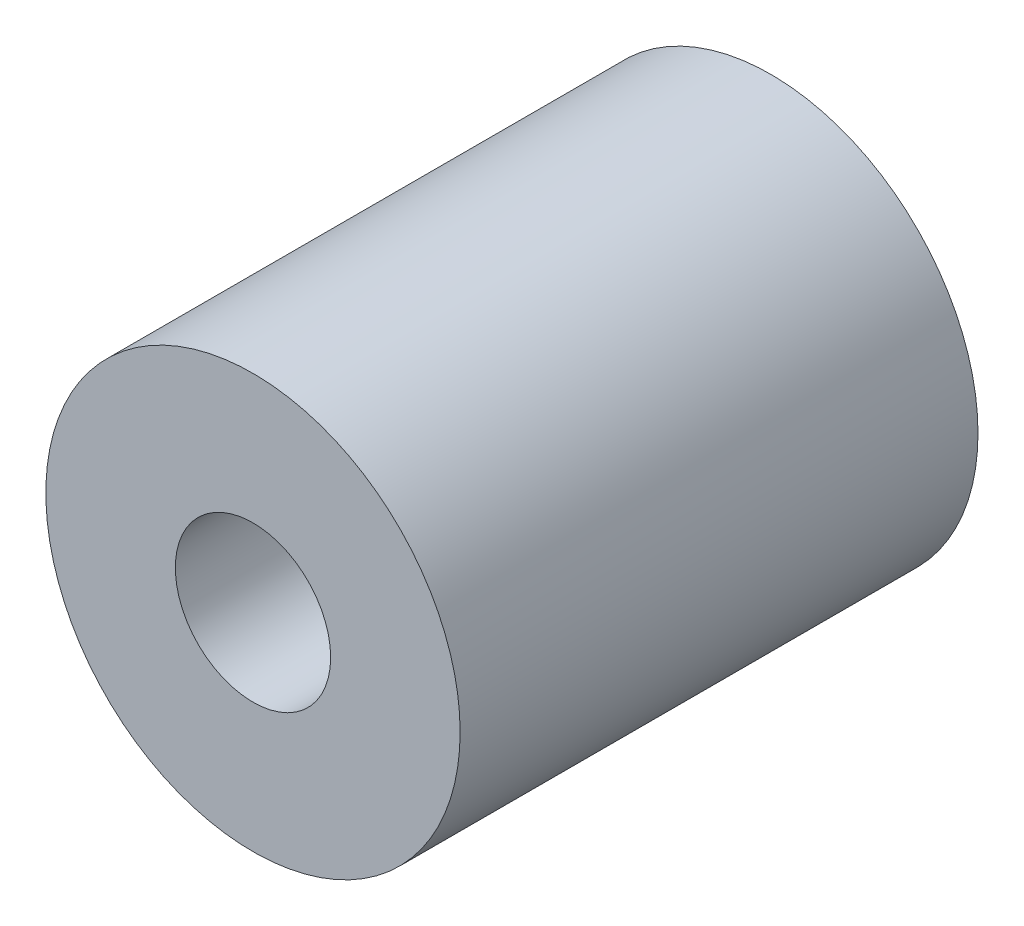
ISO-10303-21;
HEADER;
FILE_DESCRIPTION(('STEP AP214'),'2;1');
FILE_NAME('part.step','',(''),(''),'','','');
FILE_SCHEMA(('AUTOMOTIVE_DESIGN { 1 0 10303 214 1 1 1 1 }'));
ENDSEC;
DATA;
#1=APPLICATION_CONTEXT('core data for automotive mechanical design processes');
#2=APPLICATION_PROTOCOL_DEFINITION('international standard','automotive_design',2000,#1);
#3=PRODUCT_CONTEXT('',#1,'mechanical');
#4=PRODUCT('Part','Part','',(#3));
#5=PRODUCT_RELATED_PRODUCT_CATEGORY('part','',(#4));
#6=PRODUCT_DEFINITION_FORMATION('','',#4);
#7=PRODUCT_DEFINITION_CONTEXT('part definition',#1,'design');
#8=PRODUCT_DEFINITION('design','',#6,#7);
#9=PRODUCT_DEFINITION_SHAPE('','',#8);
#10=(LENGTH_UNIT() NAMED_UNIT(*) SI_UNIT(.MILLI.,.METRE.));
#11=(NAMED_UNIT(*) PLANE_ANGLE_UNIT() SI_UNIT($,.RADIAN.));
#12=(NAMED_UNIT(*) SI_UNIT($,.STERADIAN.) SOLID_ANGLE_UNIT());
#13=UNCERTAINTY_MEASURE_WITH_UNIT(LENGTH_MEASURE(1.E-05),#10,'distance_accuracy_value','');
#14=(GEOMETRIC_REPRESENTATION_CONTEXT(3) GLOBAL_UNCERTAINTY_ASSIGNED_CONTEXT((#13)) GLOBAL_UNIT_ASSIGNED_CONTEXT((#10,
#11,#12)) REPRESENTATION_CONTEXT('',''));
#15=CARTESIAN_POINT('',(0.,0.,0.));
#16=DIRECTION('',(0.,0.,1.));
#17=DIRECTION('',(1.,0.,0.));
#18=AXIS2_PLACEMENT_3D('',#15,#16,#17);
#19=CARTESIAN_POINT('',(0.,0.,10.));
#20=DIRECTION('',(0.,0.,1.));
#21=DIRECTION('',(1.,0.,0.));
#22=AXIS2_PLACEMENT_3D('',#19,#20,#21);
#23=PLANE('',#22);
#24=CARTESIAN_POINT('',(0.,0.,10.));
#25=DIRECTION('',(0.,0.,1.));
#26=DIRECTION('',(1.,0.,0.));
#27=AXIS2_PLACEMENT_3D('',#24,#25,#26);
#28=CIRCLE('',#27,4.);
#29=CARTESIAN_POINT('',(4.,0.,10.));
#30=VERTEX_POINT('',#29);
#31=EDGE_CURVE('E10',#30,#30,#28,.T.);
#32=ORIENTED_EDGE('',*,*,#31,.T.);
#33=EDGE_LOOP('',(#32));
#34=FACE_BOUND('',#33,.T.);
#35=CARTESIAN_POINT('',(0.,0.,10.));
#36=DIRECTION('',(0.,0.,1.));
#37=DIRECTION('',(1.,0.,0.));
#38=AXIS2_PLACEMENT_3D('',#35,#36,#37);
#39=CIRCLE('',#38,1.5);
#40=CARTESIAN_POINT('',(1.5,0.,10.));
#41=VERTEX_POINT('',#40);
#42=EDGE_CURVE('E42',#41,#41,#39,.T.);
#43=ORIENTED_EDGE('',*,*,#42,.F.);
#44=EDGE_LOOP('',(#43));
#45=FACE_BOUND('',#44,.T.);
#46=ADVANCED_FACE('F31',(#34,#45),#23,.T.);
#47=CARTESIAN_POINT('',(0.,0.,0.));
#48=DIRECTION('',(0.,0.,1.));
#49=DIRECTION('',(1.,0.,0.));
#50=AXIS2_PLACEMENT_3D('',#47,#48,#49);
#51=PLANE('',#50);
#52=CARTESIAN_POINT('',(0.,0.,0.));
#53=DIRECTION('',(0.,0.,1.));
#54=DIRECTION('',(1.,0.,0.));
#55=AXIS2_PLACEMENT_3D('',#52,#53,#54);
#56=CIRCLE('',#55,4.);
#57=CARTESIAN_POINT('',(4.,0.,0.));
#58=VERTEX_POINT('',#57);
#59=EDGE_CURVE('E35',#58,#58,#56,.T.);
#60=ORIENTED_EDGE('',*,*,#59,.F.);
#61=EDGE_LOOP('',(#60));
#62=FACE_BOUND('',#61,.T.);
#63=CARTESIAN_POINT('',(0.,0.,0.));
#64=DIRECTION('',(0.,0.,1.));
#65=DIRECTION('',(1.,0.,0.));
#66=AXIS2_PLACEMENT_3D('',#63,#64,#65);
#67=CIRCLE('',#66,1.5);
#68=CARTESIAN_POINT('',(1.5,0.,0.));
#69=VERTEX_POINT('',#68);
#70=EDGE_CURVE('E44',#69,#69,#67,.T.);
#71=ORIENTED_EDGE('',*,*,#70,.T.);
#72=EDGE_LOOP('',(#71));
#73=FACE_BOUND('',#72,.T.);
#74=ADVANCED_FACE('F54',(#62,#73),#51,.F.);
#75=CARTESIAN_POINT('',(0.,0.,10.));
#76=DIRECTION('',(0.,0.,-1.));
#77=DIRECTION('',(-1.,0.,0.));
#78=AXIS2_PLACEMENT_3D('',#75,#76,#77);
#79=CYLINDRICAL_SURFACE('',#78,4.);
#80=ORIENTED_EDGE('',*,*,#31,.F.);
#81=EDGE_LOOP('',(#80));
#82=FACE_BOUND('',#81,.T.);
#83=ORIENTED_EDGE('',*,*,#59,.T.);
#84=EDGE_LOOP('',(#83));
#85=FACE_BOUND('',#84,.T.);
#86=ADVANCED_FACE('F33',(#82,#85),#79,.T.);
#87=CARTESIAN_POINT('',(0.,0.,10.));
#88=DIRECTION('',(0.,0.,-1.));
#89=DIRECTION('',(-1.,0.,0.));
#90=AXIS2_PLACEMENT_3D('',#87,#88,#89);
#91=CYLINDRICAL_SURFACE('',#90,1.5);
#92=ORIENTED_EDGE('',*,*,#42,.T.);
#93=EDGE_LOOP('',(#92));
#94=FACE_BOUND('',#93,.T.);
#95=ORIENTED_EDGE('',*,*,#70,.F.);
#96=EDGE_LOOP('',(#95));
#97=FACE_BOUND('',#96,.T.);
#98=ADVANCED_FACE('F50',(#94,#97),#91,.F.);
#99=CLOSED_SHELL('',(#46,#74,#86,#98));
#100=MANIFOLD_SOLID_BREP('B2',#99);
#101=ADVANCED_BREP_SHAPE_REPRESENTATION('',(#18,#100),#14);
#102=SHAPE_DEFINITION_REPRESENTATION(#9,#101);
ENDSEC;
END-ISO-10303-21;
